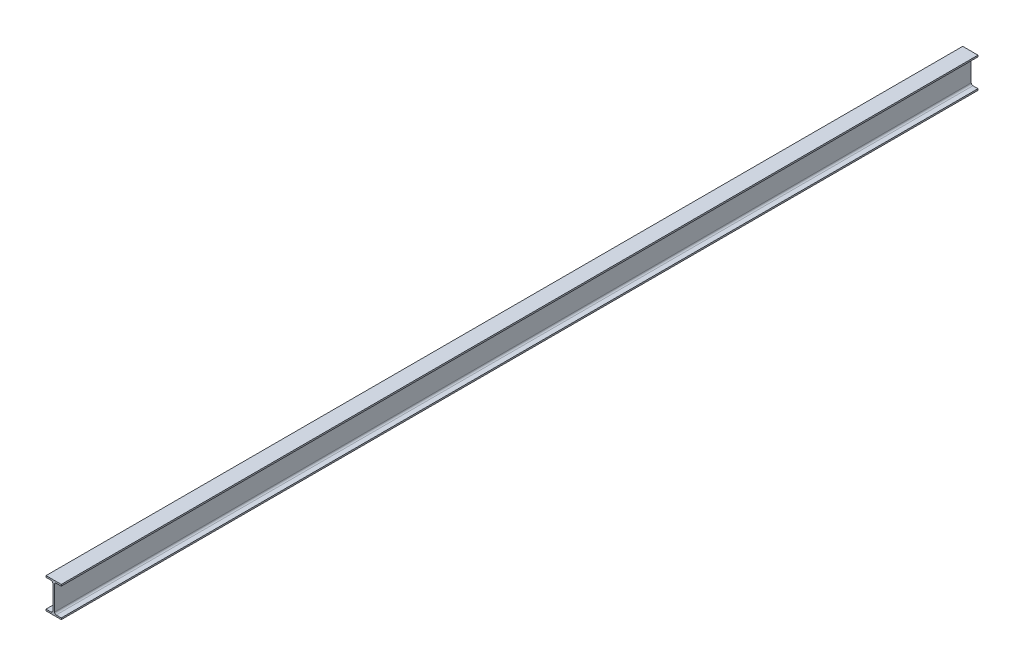
ISO-10303-21;
HEADER;
FILE_DESCRIPTION(('STEP AP214'),'2;1');
FILE_NAME('part.step','',(''),(''),'','','');
FILE_SCHEMA(('AUTOMOTIVE_DESIGN { 1 0 10303 214 1 1 1 1 }'));
ENDSEC;
DATA;
#1=APPLICATION_CONTEXT('core data for automotive mechanical design processes');
#2=APPLICATION_PROTOCOL_DEFINITION('international standard','automotive_design',2000,#1);
#3=PRODUCT_CONTEXT('',#1,'mechanical');
#4=PRODUCT('Part','Part','',(#3));
#5=PRODUCT_RELATED_PRODUCT_CATEGORY('part','',(#4));
#6=PRODUCT_DEFINITION_FORMATION('','',#4);
#7=PRODUCT_DEFINITION_CONTEXT('part definition',#1,'design');
#8=PRODUCT_DEFINITION('design','',#6,#7);
#9=PRODUCT_DEFINITION_SHAPE('','',#8);
#10=(LENGTH_UNIT() NAMED_UNIT(*) SI_UNIT(.MILLI.,.METRE.));
#11=(NAMED_UNIT(*) PLANE_ANGLE_UNIT() SI_UNIT($,.RADIAN.));
#12=(NAMED_UNIT(*) SI_UNIT($,.STERADIAN.) SOLID_ANGLE_UNIT());
#13=UNCERTAINTY_MEASURE_WITH_UNIT(LENGTH_MEASURE(1.E-05),#10,'distance_accuracy_value','');
#14=(GEOMETRIC_REPRESENTATION_CONTEXT(3) GLOBAL_UNCERTAINTY_ASSIGNED_CONTEXT((#13)) GLOBAL_UNIT_ASSIGNED_CONTEXT((#10,
#11,#12)) REPRESENTATION_CONTEXT('',''));
#15=CARTESIAN_POINT('',(0.,0.,0.));
#16=DIRECTION('',(0.,0.,1.));
#17=DIRECTION('',(1.,0.,0.));
#18=AXIS2_PLACEMENT_3D('',#15,#16,#17);
#19=CARTESIAN_POINT('',(16.7,-79.,3000.));
#20=DIRECTION('',(0.,0.,-1.));
#21=DIRECTION('',(-1.,0.,0.));
#22=AXIS2_PLACEMENT_3D('',#19,#20,#21);
#23=CYLINDRICAL_SURFACE('',#22,11.);
#24=CARTESIAN_POINT('',(16.7,-79.,-3000.));
#25=DIRECTION('',(0.,0.,-1.));
#26=DIRECTION('',(-1.,0.,0.));
#27=AXIS2_PLACEMENT_3D('',#24,#25,#26);
#28=CIRCLE('',#27,11.);
#29=CARTESIAN_POINT('',(16.7000000000001,-90.,-3000.));
#30=VERTEX_POINT('',#29);
#31=CARTESIAN_POINT('',(5.70000000000001,-78.9999999999999,-3000.));
#32=VERTEX_POINT('',#31);
#33=EDGE_CURVE('E188',#30,#32,#28,.T.);
#34=ORIENTED_EDGE('',*,*,#33,.T.);
#35=DIRECTION('',(0.,0.,-1.));
#36=VECTOR('',#35,1.);
#37=CARTESIAN_POINT('',(5.70000000000001,-78.9999999999999,3000.));
#38=LINE('',#37,#36);
#39=CARTESIAN_POINT('',(5.70000000000001,-78.9999999999999,3000.));
#40=VERTEX_POINT('',#39);
#41=EDGE_CURVE('E11',#40,#32,#38,.T.);
#42=ORIENTED_EDGE('',*,*,#41,.F.);
#43=CARTESIAN_POINT('',(16.7,-79.,3000.));
#44=DIRECTION('',(0.,0.,-1.));
#45=DIRECTION('',(-1.,0.,0.));
#46=AXIS2_PLACEMENT_3D('',#43,#44,#45);
#47=CIRCLE('',#46,11.);
#48=CARTESIAN_POINT('',(16.7000000000001,-90.,3000.));
#49=VERTEX_POINT('',#48);
#50=EDGE_CURVE('E235',#49,#40,#47,.T.);
#51=ORIENTED_EDGE('',*,*,#50,.F.);
#52=DIRECTION('',(0.,0.,-1.));
#53=VECTOR('',#52,1.);
#54=CARTESIAN_POINT('',(16.7000000000001,-90.,3000.));
#55=LINE('',#54,#53);
#56=EDGE_CURVE('E184',#49,#30,#55,.T.);
#57=ORIENTED_EDGE('',*,*,#56,.T.);
#58=EDGE_LOOP('',(#34,#42,#51,#57));
#59=FACE_BOUND('',#58,.T.);
#60=ADVANCED_FACE('F39',(#59),#23,.F.);
#61=CARTESIAN_POINT('',(5.7,0.,3000.));
#62=DIRECTION('',(-1.,0.,0.));
#63=DIRECTION('',(0.,0.,1.));
#64=AXIS2_PLACEMENT_3D('',#61,#62,#63);
#65=PLANE('',#64);
#66=DIRECTION('',(0.,1.,0.));
#67=VECTOR('',#66,1.);
#68=CARTESIAN_POINT('',(5.7,0.,-3000.));
#69=LINE('',#68,#67);
#70=CARTESIAN_POINT('',(5.7,78.9999999999999,-3000.));
#71=VERTEX_POINT('',#70);
#72=EDGE_CURVE('E192',#32,#71,#69,.T.);
#73=ORIENTED_EDGE('',*,*,#72,.T.);
#74=DIRECTION('',(0.,0.,-1.));
#75=VECTOR('',#74,1.);
#76=CARTESIAN_POINT('',(5.7,78.9999999999999,3000.));
#77=LINE('',#76,#75);
#78=CARTESIAN_POINT('',(5.7,78.9999999999999,3000.));
#79=VERTEX_POINT('',#78);
#80=EDGE_CURVE('E48',#79,#71,#77,.T.);
#81=ORIENTED_EDGE('',*,*,#80,.F.);
#82=DIRECTION('',(0.,1.,0.));
#83=VECTOR('',#82,1.);
#84=CARTESIAN_POINT('',(5.7,0.,3000.));
#85=LINE('',#84,#83);
#86=EDGE_CURVE('E123',#40,#79,#85,.T.);
#87=ORIENTED_EDGE('',*,*,#86,.F.);
#88=ORIENTED_EDGE('',*,*,#41,.T.);
#89=EDGE_LOOP('',(#73,#81,#87,#88));
#90=FACE_BOUND('',#89,.T.);
#91=ADVANCED_FACE('F357',(#90),#65,.F.);
#92=CARTESIAN_POINT('',(16.7,79.,3000.));
#93=DIRECTION('',(0.,0.,-1.));
#94=DIRECTION('',(-1.,0.,0.));
#95=AXIS2_PLACEMENT_3D('',#92,#93,#94);
#96=CYLINDRICAL_SURFACE('',#95,11.);
#97=CARTESIAN_POINT('',(16.7,79.,-3000.));
#98=DIRECTION('',(0.,0.,-1.));
#99=DIRECTION('',(1.,0.,0.));
#100=AXIS2_PLACEMENT_3D('',#97,#98,#99);
#101=CIRCLE('',#100,11.);
#102=CARTESIAN_POINT('',(16.7000000000001,90.,-3000.));
#103=VERTEX_POINT('',#102);
#104=EDGE_CURVE('E195',#71,#103,#101,.T.);
#105=ORIENTED_EDGE('',*,*,#104,.T.);
#106=DIRECTION('',(0.,0.,-1.));
#107=VECTOR('',#106,1.);
#108=CARTESIAN_POINT('',(16.7000000000001,90.,3000.));
#109=LINE('',#108,#107);
#110=CARTESIAN_POINT('',(16.7000000000001,90.,3000.));
#111=VERTEX_POINT('',#110);
#112=EDGE_CURVE('E278',#111,#103,#109,.T.);
#113=ORIENTED_EDGE('',*,*,#112,.F.);
#114=CARTESIAN_POINT('',(16.7,79.,3000.));
#115=DIRECTION('',(0.,0.,-1.));
#116=DIRECTION('',(1.,0.,0.));
#117=AXIS2_PLACEMENT_3D('',#114,#115,#116);
#118=CIRCLE('',#117,11.);
#119=EDGE_CURVE('E288',#79,#111,#118,.T.);
#120=ORIENTED_EDGE('',*,*,#119,.F.);
#121=ORIENTED_EDGE('',*,*,#80,.T.);
#122=EDGE_LOOP('',(#105,#113,#120,#121));
#123=FACE_BOUND('',#122,.T.);
#124=ADVANCED_FACE('F286',(#123),#96,.F.);
#125=CARTESIAN_POINT('',(16.7000000000001,90.,3000.));
#126=DIRECTION('',(0.,1.,0.));
#127=DIRECTION('',(0.,0.,1.));
#128=AXIS2_PLACEMENT_3D('',#125,#126,#127);
#129=PLANE('',#128);
#130=DIRECTION('',(1.,0.,0.));
#131=VECTOR('',#130,1.);
#132=CARTESIAN_POINT('',(16.7000000000001,90.,-3000.));
#133=LINE('',#132,#131);
#134=CARTESIAN_POINT('',(50.,90.,-3000.));
#135=VERTEX_POINT('',#134);
#136=EDGE_CURVE('E198',#103,#135,#133,.T.);
#137=ORIENTED_EDGE('',*,*,#136,.T.);
#138=DIRECTION('',(0.,0.,-1.));
#139=VECTOR('',#138,1.);
#140=CARTESIAN_POINT('',(50.,90.,3000.));
#141=LINE('',#140,#139);
#142=CARTESIAN_POINT('',(50.,90.,3000.));
#143=VERTEX_POINT('',#142);
#144=EDGE_CURVE('E274',#143,#135,#141,.T.);
#145=ORIENTED_EDGE('',*,*,#144,.F.);
#146=DIRECTION('',(1.,0.,0.));
#147=VECTOR('',#146,1.);
#148=CARTESIAN_POINT('',(16.7000000000001,90.,3000.));
#149=LINE('',#148,#147);
#150=EDGE_CURVE('E307',#111,#143,#149,.T.);
#151=ORIENTED_EDGE('',*,*,#150,.F.);
#152=ORIENTED_EDGE('',*,*,#112,.T.);
#153=EDGE_LOOP('',(#137,#145,#151,#152));
#154=FACE_BOUND('',#153,.T.);
#155=ADVANCED_FACE('F297',(#154),#129,.F.);
#156=CARTESIAN_POINT('',(50.,90.,3000.));
#157=DIRECTION('',(-1.,0.,0.));
#158=DIRECTION('',(0.,0.,1.));
#159=AXIS2_PLACEMENT_3D('',#156,#157,#158);
#160=PLANE('',#159);
#161=DIRECTION('',(0.,1.,0.));
#162=VECTOR('',#161,1.);
#163=CARTESIAN_POINT('',(50.,90.,-3000.));
#164=LINE('',#163,#162);
#165=CARTESIAN_POINT('',(50.,100.,-3000.));
#166=VERTEX_POINT('',#165);
#167=EDGE_CURVE('E201',#135,#166,#164,.T.);
#168=ORIENTED_EDGE('',*,*,#167,.T.);
#169=DIRECTION('',(0.,0.,-1.));
#170=VECTOR('',#169,1.);
#171=CARTESIAN_POINT('',(50.,100.,3000.));
#172=LINE('',#171,#170);
#173=CARTESIAN_POINT('',(50.,100.,3000.));
#174=VERTEX_POINT('',#173);
#175=EDGE_CURVE('E270',#174,#166,#172,.T.);
#176=ORIENTED_EDGE('',*,*,#175,.F.);
#177=DIRECTION('',(0.,1.,0.));
#178=VECTOR('',#177,1.);
#179=CARTESIAN_POINT('',(50.,90.,3000.));
#180=LINE('',#179,#178);
#181=EDGE_CURVE('E303',#143,#174,#180,.T.);
#182=ORIENTED_EDGE('',*,*,#181,.F.);
#183=ORIENTED_EDGE('',*,*,#144,.T.);
#184=EDGE_LOOP('',(#168,#176,#182,#183));
#185=FACE_BOUND('',#184,.T.);
#186=ADVANCED_FACE('F301',(#185),#160,.F.);
#187=CARTESIAN_POINT('',(50.,100.,3000.));
#188=DIRECTION('',(0.,-1.,0.));
#189=DIRECTION('',(0.,0.,-1.));
#190=AXIS2_PLACEMENT_3D('',#187,#188,#189);
#191=PLANE('',#190);
#192=DIRECTION('',(-1.,0.,0.));
#193=VECTOR('',#192,1.);
#194=CARTESIAN_POINT('',(50.,100.,-3000.));
#195=LINE('',#194,#193);
#196=CARTESIAN_POINT('',(-50.,100.,-3000.));
#197=VERTEX_POINT('',#196);
#198=EDGE_CURVE('E204',#166,#197,#195,.T.);
#199=ORIENTED_EDGE('',*,*,#198,.T.);
#200=DIRECTION('',(0.,0.,-1.));
#201=VECTOR('',#200,1.);
#202=CARTESIAN_POINT('',(-50.,100.,3000.));
#203=LINE('',#202,#201);
#204=CARTESIAN_POINT('',(-50.,100.,3000.));
#205=VERTEX_POINT('',#204);
#206=EDGE_CURVE('E266',#205,#197,#203,.T.);
#207=ORIENTED_EDGE('',*,*,#206,.F.);
#208=DIRECTION('',(-1.,0.,0.));
#209=VECTOR('',#208,1.);
#210=CARTESIAN_POINT('',(50.,100.,3000.));
#211=LINE('',#210,#209);
#212=EDGE_CURVE('E306',#174,#205,#211,.T.);
#213=ORIENTED_EDGE('',*,*,#212,.F.);
#214=ORIENTED_EDGE('',*,*,#175,.T.);
#215=EDGE_LOOP('',(#199,#207,#213,#214));
#216=FACE_BOUND('',#215,.T.);
#217=ADVANCED_FACE('F370',(#216),#191,.F.);
#218=CARTESIAN_POINT('',(-50.,100.,3000.));
#219=DIRECTION('',(1.,0.,0.));
#220=DIRECTION('',(0.,0.,-1.));
#221=AXIS2_PLACEMENT_3D('',#218,#219,#220);
#222=PLANE('',#221);
#223=DIRECTION('',(0.,-1.,0.));
#224=VECTOR('',#223,1.);
#225=CARTESIAN_POINT('',(-50.,100.,-3000.));
#226=LINE('',#225,#224);
#227=CARTESIAN_POINT('',(-50.,90.,-3000.));
#228=VERTEX_POINT('',#227);
#229=EDGE_CURVE('E207',#197,#228,#226,.T.);
#230=ORIENTED_EDGE('',*,*,#229,.T.);
#231=DIRECTION('',(0.,0.,-1.));
#232=VECTOR('',#231,1.);
#233=CARTESIAN_POINT('',(-50.,90.,3000.));
#234=LINE('',#233,#232);
#235=CARTESIAN_POINT('',(-50.,90.,3000.));
#236=VERTEX_POINT('',#235);
#237=EDGE_CURVE('E262',#236,#228,#234,.T.);
#238=ORIENTED_EDGE('',*,*,#237,.F.);
#239=DIRECTION('',(0.,-1.,0.));
#240=VECTOR('',#239,1.);
#241=CARTESIAN_POINT('',(-50.,100.,3000.));
#242=LINE('',#241,#240);
#243=EDGE_CURVE('E311',#205,#236,#242,.T.);
#244=ORIENTED_EDGE('',*,*,#243,.F.);
#245=ORIENTED_EDGE('',*,*,#206,.T.);
#246=EDGE_LOOP('',(#230,#238,#244,#245));
#247=FACE_BOUND('',#246,.T.);
#248=ADVANCED_FACE('F373',(#247),#222,.F.);
#249=CARTESIAN_POINT('',(-50.,90.,3000.));
#250=DIRECTION('',(0.,1.,0.));
#251=DIRECTION('',(0.,0.,1.));
#252=AXIS2_PLACEMENT_3D('',#249,#250,#251);
#253=PLANE('',#252);
#254=DIRECTION('',(1.,0.,0.));
#255=VECTOR('',#254,1.);
#256=CARTESIAN_POINT('',(-50.,90.,-3000.));
#257=LINE('',#256,#255);
#258=CARTESIAN_POINT('',(-16.7000000000001,90.,-3000.));
#259=VERTEX_POINT('',#258);
#260=EDGE_CURVE('E210',#228,#259,#257,.T.);
#261=ORIENTED_EDGE('',*,*,#260,.T.);
#262=DIRECTION('',(0.,0.,-1.));
#263=VECTOR('',#262,1.);
#264=CARTESIAN_POINT('',(-16.7000000000001,90.,3000.));
#265=LINE('',#264,#263);
#266=CARTESIAN_POINT('',(-16.7000000000001,90.,3000.));
#267=VERTEX_POINT('',#266);
#268=EDGE_CURVE('E258',#267,#259,#265,.T.);
#269=ORIENTED_EDGE('',*,*,#268,.F.);
#270=DIRECTION('',(1.,0.,0.));
#271=VECTOR('',#270,1.);
#272=CARTESIAN_POINT('',(-50.,90.,3000.));
#273=LINE('',#272,#271);
#274=EDGE_CURVE('E318',#236,#267,#273,.T.);
#275=ORIENTED_EDGE('',*,*,#274,.F.);
#276=ORIENTED_EDGE('',*,*,#237,.T.);
#277=EDGE_LOOP('',(#261,#269,#275,#276));
#278=FACE_BOUND('',#277,.T.);
#279=ADVANCED_FACE('F377',(#278),#253,.F.);
#280=CARTESIAN_POINT('',(-16.7,79.,3000.));
#281=DIRECTION('',(0.,0.,-1.));
#282=DIRECTION('',(-1.,0.,0.));
#283=AXIS2_PLACEMENT_3D('',#280,#281,#282);
#284=CYLINDRICAL_SURFACE('',#283,11.);
#285=CARTESIAN_POINT('',(-16.7,79.,-3000.));
#286=DIRECTION('',(0.,0.,-1.));
#287=DIRECTION('',(1.,0.,0.));
#288=AXIS2_PLACEMENT_3D('',#285,#286,#287);
#289=CIRCLE('',#288,11.);
#290=CARTESIAN_POINT('',(-5.7,78.9999999999999,-3000.));
#291=VERTEX_POINT('',#290);
#292=EDGE_CURVE('E213',#259,#291,#289,.T.);
#293=ORIENTED_EDGE('',*,*,#292,.T.);
#294=DIRECTION('',(0.,0.,-1.));
#295=VECTOR('',#294,1.);
#296=CARTESIAN_POINT('',(-5.7,78.9999999999999,3000.));
#297=LINE('',#296,#295);
#298=CARTESIAN_POINT('',(-5.7,78.9999999999999,3000.));
#299=VERTEX_POINT('',#298);
#300=EDGE_CURVE('E254',#299,#291,#297,.T.);
#301=ORIENTED_EDGE('',*,*,#300,.F.);
#302=CARTESIAN_POINT('',(-16.7,79.,3000.));
#303=DIRECTION('',(0.,0.,-1.));
#304=DIRECTION('',(1.,0.,0.));
#305=AXIS2_PLACEMENT_3D('',#302,#303,#304);
#306=CIRCLE('',#305,11.);
#307=EDGE_CURVE('E321',#267,#299,#306,.T.);
#308=ORIENTED_EDGE('',*,*,#307,.F.);
#309=ORIENTED_EDGE('',*,*,#268,.T.);
#310=EDGE_LOOP('',(#293,#301,#308,#309));
#311=FACE_BOUND('',#310,.T.);
#312=ADVANCED_FACE('F381',(#311),#284,.F.);
#313=CARTESIAN_POINT('',(-5.7,0.,3000.));
#314=DIRECTION('',(1.,0.,0.));
#315=DIRECTION('',(0.,0.,-1.));
#316=AXIS2_PLACEMENT_3D('',#313,#314,#315);
#317=PLANE('',#316);
#318=DIRECTION('',(0.,-1.,0.));
#319=VECTOR('',#318,1.);
#320=CARTESIAN_POINT('',(-5.7,0.,-3000.));
#321=LINE('',#320,#319);
#322=CARTESIAN_POINT('',(-5.7,-79.,-3000.));
#323=VERTEX_POINT('',#322);
#324=EDGE_CURVE('E217',#291,#323,#321,.T.);
#325=ORIENTED_EDGE('',*,*,#324,.T.);
#326=DIRECTION('',(0.,0.,-1.));
#327=VECTOR('',#326,1.);
#328=CARTESIAN_POINT('',(-5.7,-79.,3000.));
#329=LINE('',#328,#327);
#330=CARTESIAN_POINT('',(-5.7,-79.,3000.));
#331=VERTEX_POINT('',#330);
#332=EDGE_CURVE('E250',#331,#323,#329,.T.);
#333=ORIENTED_EDGE('',*,*,#332,.F.);
#334=DIRECTION('',(0.,-1.,0.));
#335=VECTOR('',#334,1.);
#336=CARTESIAN_POINT('',(-5.7,0.,3000.));
#337=LINE('',#336,#335);
#338=EDGE_CURVE('E324',#299,#331,#337,.T.);
#339=ORIENTED_EDGE('',*,*,#338,.F.);
#340=ORIENTED_EDGE('',*,*,#300,.T.);
#341=EDGE_LOOP('',(#325,#333,#339,#340));
#342=FACE_BOUND('',#341,.T.);
#343=ADVANCED_FACE('F385',(#342),#317,.F.);
#344=CARTESIAN_POINT('',(-16.7,-79.,3000.));
#345=DIRECTION('',(0.,0.,-1.));
#346=DIRECTION('',(-1.,0.,0.));
#347=AXIS2_PLACEMENT_3D('',#344,#345,#346);
#348=CYLINDRICAL_SURFACE('',#347,11.);
#349=CARTESIAN_POINT('',(-16.7,-79.,-3000.));
#350=DIRECTION('',(0.,0.,-1.));
#351=DIRECTION('',(1.,0.,0.));
#352=AXIS2_PLACEMENT_3D('',#349,#350,#351);
#353=CIRCLE('',#352,11.);
#354=CARTESIAN_POINT('',(-16.7000000000001,-90.,-3000.));
#355=VERTEX_POINT('',#354);
#356=EDGE_CURVE('E220',#323,#355,#353,.T.);
#357=ORIENTED_EDGE('',*,*,#356,.T.);
#358=DIRECTION('',(0.,0.,-1.));
#359=VECTOR('',#358,1.);
#360=CARTESIAN_POINT('',(-16.7000000000001,-90.,3000.));
#361=LINE('',#360,#359);
#362=CARTESIAN_POINT('',(-16.7000000000001,-90.,3000.));
#363=VERTEX_POINT('',#362);
#364=EDGE_CURVE('E246',#363,#355,#361,.T.);
#365=ORIENTED_EDGE('',*,*,#364,.F.);
#366=CARTESIAN_POINT('',(-16.7,-79.,3000.));
#367=DIRECTION('',(0.,0.,-1.));
#368=DIRECTION('',(1.,0.,0.));
#369=AXIS2_PLACEMENT_3D('',#366,#367,#368);
#370=CIRCLE('',#369,11.);
#371=EDGE_CURVE('E327',#331,#363,#370,.T.);
#372=ORIENTED_EDGE('',*,*,#371,.F.);
#373=ORIENTED_EDGE('',*,*,#332,.T.);
#374=EDGE_LOOP('',(#357,#365,#372,#373));
#375=FACE_BOUND('',#374,.T.);
#376=ADVANCED_FACE('F389',(#375),#348,.F.);
#377=CARTESIAN_POINT('',(-16.7000000000001,-90.,3000.));
#378=DIRECTION('',(0.,-1.,0.));
#379=DIRECTION('',(0.,0.,-1.));
#380=AXIS2_PLACEMENT_3D('',#377,#378,#379);
#381=PLANE('',#380);
#382=DIRECTION('',(-1.,0.,0.));
#383=VECTOR('',#382,1.);
#384=CARTESIAN_POINT('',(-16.7000000000001,-90.,-3000.));
#385=LINE('',#384,#383);
#386=CARTESIAN_POINT('',(-50.,-90.,-3000.));
#387=VERTEX_POINT('',#386);
#388=EDGE_CURVE('E223',#355,#387,#385,.T.);
#389=ORIENTED_EDGE('',*,*,#388,.T.);
#390=DIRECTION('',(0.,0.,-1.));
#391=VECTOR('',#390,1.);
#392=CARTESIAN_POINT('',(-50.,-90.,3000.));
#393=LINE('',#392,#391);
#394=CARTESIAN_POINT('',(-50.,-90.,3000.));
#395=VERTEX_POINT('',#394);
#396=EDGE_CURVE('E242',#395,#387,#393,.T.);
#397=ORIENTED_EDGE('',*,*,#396,.F.);
#398=DIRECTION('',(-1.,0.,0.));
#399=VECTOR('',#398,1.);
#400=CARTESIAN_POINT('',(-16.7000000000001,-90.,3000.));
#401=LINE('',#400,#399);
#402=EDGE_CURVE('E330',#363,#395,#401,.T.);
#403=ORIENTED_EDGE('',*,*,#402,.F.);
#404=ORIENTED_EDGE('',*,*,#364,.T.);
#405=EDGE_LOOP('',(#389,#397,#403,#404));
#406=FACE_BOUND('',#405,.T.);
#407=ADVANCED_FACE('F338',(#406),#381,.F.);
#408=CARTESIAN_POINT('',(-50.,-90.,3000.));
#409=DIRECTION('',(1.,0.,0.));
#410=DIRECTION('',(0.,0.,-1.));
#411=AXIS2_PLACEMENT_3D('',#408,#409,#410);
#412=PLANE('',#411);
#413=DIRECTION('',(0.,-1.,0.));
#414=VECTOR('',#413,1.);
#415=CARTESIAN_POINT('',(-50.,-90.,-3000.));
#416=LINE('',#415,#414);
#417=CARTESIAN_POINT('',(-50.,-100.,-3000.));
#418=VERTEX_POINT('',#417);
#419=EDGE_CURVE('E226',#387,#418,#416,.T.);
#420=ORIENTED_EDGE('',*,*,#419,.T.);
#421=DIRECTION('',(0.,0.,-1.));
#422=VECTOR('',#421,1.);
#423=CARTESIAN_POINT('',(-50.,-100.,3000.));
#424=LINE('',#423,#422);
#425=CARTESIAN_POINT('',(-50.,-100.,3000.));
#426=VERTEX_POINT('',#425);
#427=EDGE_CURVE('E177',#426,#418,#424,.T.);
#428=ORIENTED_EDGE('',*,*,#427,.F.);
#429=DIRECTION('',(0.,-1.,0.));
#430=VECTOR('',#429,1.);
#431=CARTESIAN_POINT('',(-50.,-90.,3000.));
#432=LINE('',#431,#430);
#433=EDGE_CURVE('E166',#395,#426,#432,.T.);
#434=ORIENTED_EDGE('',*,*,#433,.F.);
#435=ORIENTED_EDGE('',*,*,#396,.T.);
#436=EDGE_LOOP('',(#420,#428,#434,#435));
#437=FACE_BOUND('',#436,.T.);
#438=ADVANCED_FACE('F342',(#437),#412,.F.);
#439=CARTESIAN_POINT('',(-50.,-100.,3000.));
#440=DIRECTION('',(0.,1.,0.));
#441=DIRECTION('',(0.,0.,1.));
#442=AXIS2_PLACEMENT_3D('',#439,#440,#441);
#443=PLANE('',#442);
#444=DIRECTION('',(1.,0.,0.));
#445=VECTOR('',#444,1.);
#446=CARTESIAN_POINT('',(-50.,-100.,-3000.));
#447=LINE('',#446,#445);
#448=CARTESIAN_POINT('',(50.,-100.,-3000.));
#449=VERTEX_POINT('',#448);
#450=EDGE_CURVE('E175',#418,#449,#447,.T.);
#451=ORIENTED_EDGE('',*,*,#450,.T.);
#452=DIRECTION('',(0.,0.,-1.));
#453=VECTOR('',#452,1.);
#454=CARTESIAN_POINT('',(50.,-100.,3000.));
#455=LINE('',#454,#453);
#456=CARTESIAN_POINT('',(50.,-100.,3000.));
#457=VERTEX_POINT('',#456);
#458=EDGE_CURVE('E172',#457,#449,#455,.T.);
#459=ORIENTED_EDGE('',*,*,#458,.F.);
#460=DIRECTION('',(1.,0.,0.));
#461=VECTOR('',#460,1.);
#462=CARTESIAN_POINT('',(-50.,-100.,3000.));
#463=LINE('',#462,#461);
#464=EDGE_CURVE('E160',#426,#457,#463,.T.);
#465=ORIENTED_EDGE('',*,*,#464,.F.);
#466=ORIENTED_EDGE('',*,*,#427,.T.);
#467=EDGE_LOOP('',(#451,#459,#465,#466));
#468=FACE_BOUND('',#467,.T.);
#469=ADVANCED_FACE('F173',(#468),#443,.F.);
#470=CARTESIAN_POINT('',(50.,-100.,3000.));
#471=DIRECTION('',(-1.,0.,0.));
#472=DIRECTION('',(0.,0.,1.));
#473=AXIS2_PLACEMENT_3D('',#470,#471,#472);
#474=PLANE('',#473);
#475=DIRECTION('',(0.,1.,0.));
#476=VECTOR('',#475,1.);
#477=CARTESIAN_POINT('',(50.,-100.,-3000.));
#478=LINE('',#477,#476);
#479=CARTESIAN_POINT('',(50.,-90.,-3000.));
#480=VERTEX_POINT('',#479);
#481=EDGE_CURVE('E109',#449,#480,#478,.T.);
#482=ORIENTED_EDGE('',*,*,#481,.T.);
#483=DIRECTION('',(0.,0.,-1.));
#484=VECTOR('',#483,1.);
#485=CARTESIAN_POINT('',(50.,-90.,3000.));
#486=LINE('',#485,#484);
#487=CARTESIAN_POINT('',(50.,-90.,3000.));
#488=VERTEX_POINT('',#487);
#489=EDGE_CURVE('E178',#488,#480,#486,.T.);
#490=ORIENTED_EDGE('',*,*,#489,.F.);
#491=DIRECTION('',(0.,1.,0.));
#492=VECTOR('',#491,1.);
#493=CARTESIAN_POINT('',(50.,-100.,3000.));
#494=LINE('',#493,#492);
#495=EDGE_CURVE('E164',#457,#488,#494,.T.);
#496=ORIENTED_EDGE('',*,*,#495,.F.);
#497=ORIENTED_EDGE('',*,*,#458,.T.);
#498=EDGE_LOOP('',(#482,#490,#496,#497));
#499=FACE_BOUND('',#498,.T.);
#500=ADVANCED_FACE('F180',(#499),#474,.F.);
#501=CARTESIAN_POINT('',(50.,-90.,3000.));
#502=DIRECTION('',(0.,-1.,0.));
#503=DIRECTION('',(0.,0.,-1.));
#504=AXIS2_PLACEMENT_3D('',#501,#502,#503);
#505=PLANE('',#504);
#506=DIRECTION('',(-1.,0.,0.));
#507=VECTOR('',#506,1.);
#508=CARTESIAN_POINT('',(50.,-90.,-3000.));
#509=LINE('',#508,#507);
#510=EDGE_CURVE('E115',#480,#30,#509,.T.);
#511=ORIENTED_EDGE('',*,*,#510,.T.);
#512=ORIENTED_EDGE('',*,*,#56,.F.);
#513=DIRECTION('',(-1.,0.,0.));
#514=VECTOR('',#513,1.);
#515=CARTESIAN_POINT('',(50.,-90.,3000.));
#516=LINE('',#515,#514);
#517=EDGE_CURVE('E56',#488,#49,#516,.T.);
#518=ORIENTED_EDGE('',*,*,#517,.F.);
#519=ORIENTED_EDGE('',*,*,#489,.T.);
#520=EDGE_LOOP('',(#511,#512,#518,#519));
#521=FACE_BOUND('',#520,.T.);
#522=ADVANCED_FACE('F346',(#521),#505,.F.);
#523=CARTESIAN_POINT('',(16.7,-79.,3000.));
#524=DIRECTION('',(0.,0.,-1.));
#525=DIRECTION('',(-1.,0.,0.));
#526=AXIS2_PLACEMENT_3D('',#523,#524,#525);
#527=PLANE('',#526);
#528=ORIENTED_EDGE('',*,*,#50,.T.);
#529=ORIENTED_EDGE('',*,*,#86,.T.);
#530=ORIENTED_EDGE('',*,*,#119,.T.);
#531=ORIENTED_EDGE('',*,*,#150,.T.);
#532=ORIENTED_EDGE('',*,*,#181,.T.);
#533=ORIENTED_EDGE('',*,*,#212,.T.);
#534=ORIENTED_EDGE('',*,*,#243,.T.);
#535=ORIENTED_EDGE('',*,*,#274,.T.);
#536=ORIENTED_EDGE('',*,*,#307,.T.);
#537=ORIENTED_EDGE('',*,*,#338,.T.);
#538=ORIENTED_EDGE('',*,*,#371,.T.);
#539=ORIENTED_EDGE('',*,*,#402,.T.);
#540=ORIENTED_EDGE('',*,*,#433,.T.);
#541=ORIENTED_EDGE('',*,*,#464,.T.);
#542=ORIENTED_EDGE('',*,*,#495,.T.);
#543=ORIENTED_EDGE('',*,*,#517,.T.);
#544=EDGE_LOOP('',(#528,#529,#530,#531,#532,#533,#534,#535,#536,#537,#538,#539,#540,#541,#542,#543));
#545=FACE_BOUND('',#544,.T.);
#546=ADVANCED_FACE('F162',(#545),#527,.F.);
#547=CARTESIAN_POINT('',(16.7,-79.,-3000.));
#548=DIRECTION('',(0.,0.,-1.));
#549=DIRECTION('',(-1.,0.,0.));
#550=AXIS2_PLACEMENT_3D('',#547,#548,#549);
#551=PLANE('',#550);
#552=ORIENTED_EDGE('',*,*,#33,.F.);
#553=ORIENTED_EDGE('',*,*,#510,.F.);
#554=ORIENTED_EDGE('',*,*,#481,.F.);
#555=ORIENTED_EDGE('',*,*,#450,.F.);
#556=ORIENTED_EDGE('',*,*,#419,.F.);
#557=ORIENTED_EDGE('',*,*,#388,.F.);
#558=ORIENTED_EDGE('',*,*,#356,.F.);
#559=ORIENTED_EDGE('',*,*,#324,.F.);
#560=ORIENTED_EDGE('',*,*,#292,.F.);
#561=ORIENTED_EDGE('',*,*,#260,.F.);
#562=ORIENTED_EDGE('',*,*,#229,.F.);
#563=ORIENTED_EDGE('',*,*,#198,.F.);
#564=ORIENTED_EDGE('',*,*,#167,.F.);
#565=ORIENTED_EDGE('',*,*,#136,.F.);
#566=ORIENTED_EDGE('',*,*,#104,.F.);
#567=ORIENTED_EDGE('',*,*,#72,.F.);
#568=EDGE_LOOP('',(#552,#553,#554,#555,#556,#557,#558,#559,#560,#561,#562,#563,#564,#565,#566,#567));
#569=FACE_BOUND('',#568,.T.);
#570=ADVANCED_FACE('F292',(#569),#551,.T.);
#571=CLOSED_SHELL('',(#60,#91,#124,#155,#186,#217,#248,#279,#312,#343,#376,#407,#438,#469,#500,
#522,#546,#570));
#572=MANIFOLD_SOLID_BREP('B2',#571);
#573=ADVANCED_BREP_SHAPE_REPRESENTATION('',(#18,#572),#14);
#574=SHAPE_DEFINITION_REPRESENTATION(#9,#573);
ENDSEC;
END-ISO-10303-21;
